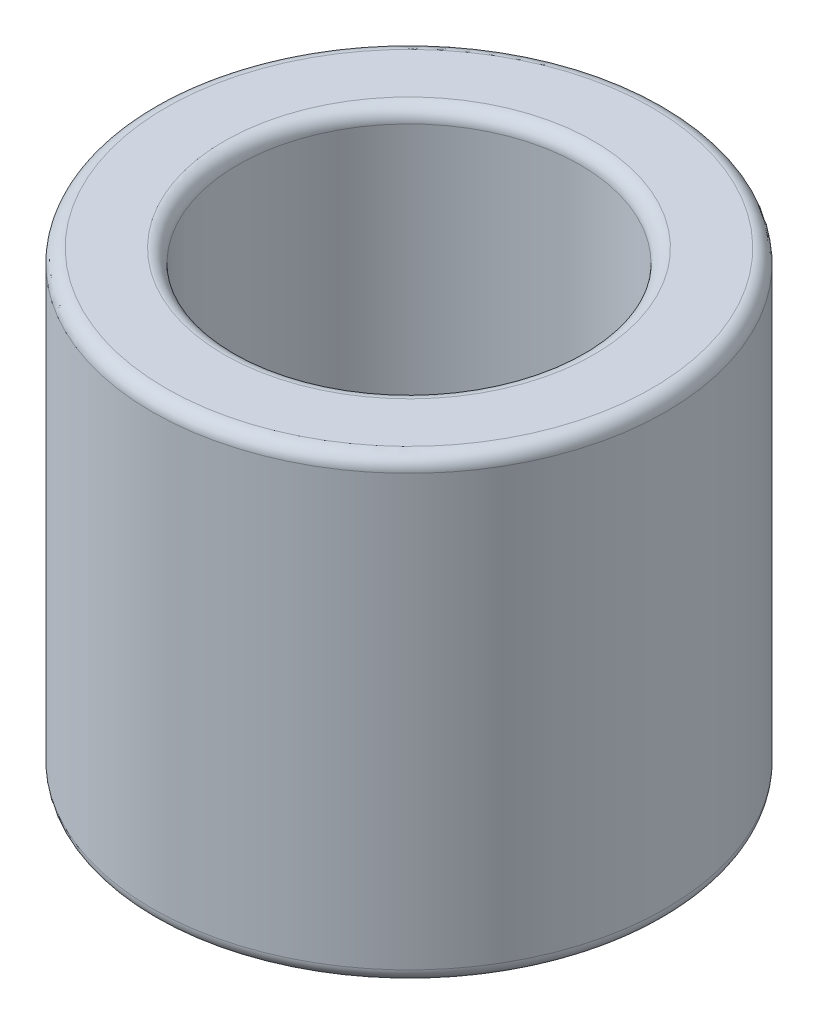
ISO-10303-21;
HEADER;
FILE_DESCRIPTION(('STEP AP214'),'2;1');
FILE_NAME('part.step','',(''),(''),'','','');
FILE_SCHEMA(('AUTOMOTIVE_DESIGN { 1 0 10303 214 1 1 1 1 }'));
ENDSEC;
DATA;
#1=APPLICATION_CONTEXT('core data for automotive mechanical design processes');
#2=APPLICATION_PROTOCOL_DEFINITION('international standard','automotive_design',2000,#1);
#3=PRODUCT_CONTEXT('',#1,'mechanical');
#4=PRODUCT('Part','Part','',(#3));
#5=PRODUCT_RELATED_PRODUCT_CATEGORY('part','',(#4));
#6=PRODUCT_DEFINITION_FORMATION('','',#4);
#7=PRODUCT_DEFINITION_CONTEXT('part definition',#1,'design');
#8=PRODUCT_DEFINITION('design','',#6,#7);
#9=PRODUCT_DEFINITION_SHAPE('','',#8);
#10=(LENGTH_UNIT() NAMED_UNIT(*) SI_UNIT(.MILLI.,.METRE.));
#11=(NAMED_UNIT(*) PLANE_ANGLE_UNIT() SI_UNIT($,.RADIAN.));
#12=(NAMED_UNIT(*) SI_UNIT($,.STERADIAN.) SOLID_ANGLE_UNIT());
#13=UNCERTAINTY_MEASURE_WITH_UNIT(LENGTH_MEASURE(1.E-05),#10,'distance_accuracy_value','');
#14=(GEOMETRIC_REPRESENTATION_CONTEXT(3) GLOBAL_UNCERTAINTY_ASSIGNED_CONTEXT((#13)) GLOBAL_UNIT_ASSIGNED_CONTEXT((#10,
#11,#12)) REPRESENTATION_CONTEXT('',''));
#15=CARTESIAN_POINT('',(0.,0.,0.));
#16=DIRECTION('',(0.,0.,1.));
#17=DIRECTION('',(1.,0.,0.));
#18=AXIS2_PLACEMENT_3D('',#15,#16,#17);
#19=CARTESIAN_POINT('',(0.,8.4836,0.));
#20=DIRECTION('',(0.,1.,0.));
#21=DIRECTION('',(0.,0.,1.));
#22=AXIS2_PLACEMENT_3D('',#19,#20,#21);
#23=PLANE('',#22);
#24=CARTESIAN_POINT('',(0.,8.4836,0.));
#25=DIRECTION('',(0.,1.,0.));
#26=DIRECTION('',(0.,0.,1.));
#27=AXIS2_PLACEMENT_3D('',#24,#25,#26);
#28=CIRCLE('',#27,4.5085);
#29=CARTESIAN_POINT('',(0.,8.4836,4.5085));
#30=VERTEX_POINT('',#29);
#31=EDGE_CURVE('E10',#30,#30,#28,.T.);
#32=ORIENTED_EDGE('',*,*,#31,.T.);
#33=EDGE_LOOP('',(#32));
#34=FACE_BOUND('',#33,.T.);
#35=CARTESIAN_POINT('',(0.,8.4836,0.));
#36=DIRECTION('',(0.,1.,0.));
#37=DIRECTION('',(0.,0.,1.));
#38=AXIS2_PLACEMENT_3D('',#35,#36,#37);
#39=CIRCLE('',#38,3.429);
#40=CARTESIAN_POINT('',(0.,8.4836,3.429));
#41=VERTEX_POINT('',#40);
#42=EDGE_CURVE('E40',#41,#41,#39,.F.);
#43=ORIENTED_EDGE('',*,*,#42,.T.);
#44=EDGE_LOOP('',(#43));
#45=FACE_BOUND('',#44,.T.);
#46=ADVANCED_FACE('F33',(#34,#45),#23,.T.);
#47=CARTESIAN_POINT('',(0.,0.,0.));
#48=DIRECTION('',(0.,1.,0.));
#49=DIRECTION('',(0.,0.,1.));
#50=AXIS2_PLACEMENT_3D('',#47,#48,#49);
#51=PLANE('',#50);
#52=CARTESIAN_POINT('',(0.,0.,0.));
#53=DIRECTION('',(0.,1.,0.));
#54=DIRECTION('',(0.,0.,1.));
#55=AXIS2_PLACEMENT_3D('',#52,#53,#54);
#56=CIRCLE('',#55,4.5085);
#57=CARTESIAN_POINT('',(0.,0.,4.5085));
#58=VERTEX_POINT('',#57);
#59=EDGE_CURVE('E53',#58,#58,#56,.F.);
#60=ORIENTED_EDGE('',*,*,#59,.T.);
#61=EDGE_LOOP('',(#60));
#62=FACE_BOUND('',#61,.T.);
#63=CARTESIAN_POINT('',(0.,0.,0.));
#64=DIRECTION('',(0.,1.,0.));
#65=DIRECTION('',(0.,0.,1.));
#66=AXIS2_PLACEMENT_3D('',#63,#64,#65);
#67=CIRCLE('',#66,3.429);
#68=CARTESIAN_POINT('',(0.,0.,3.429));
#69=VERTEX_POINT('',#68);
#70=EDGE_CURVE('E56',#69,#69,#67,.T.);
#71=ORIENTED_EDGE('',*,*,#70,.T.);
#72=EDGE_LOOP('',(#71));
#73=FACE_BOUND('',#72,.T.);
#74=ADVANCED_FACE('F81',(#62,#73),#51,.F.);
#75=CARTESIAN_POINT('',(0.,8.4836,0.));
#76=DIRECTION('',(0.,-1.,0.));
#77=DIRECTION('',(0.,0.,-1.));
#78=AXIS2_PLACEMENT_3D('',#75,#76,#77);
#79=CYLINDRICAL_SURFACE('',#78,4.7625);
#80=CARTESIAN_POINT('',(0.,0.254000000000001,0.));
#81=DIRECTION('',(0.,1.,0.));
#82=DIRECTION('',(0.,0.,1.));
#83=AXIS2_PLACEMENT_3D('',#80,#81,#82);
#84=CIRCLE('',#83,4.7625);
#85=CARTESIAN_POINT('',(0.,0.253999999999999,-4.7625));
#86=VERTEX_POINT('',#85);
#87=EDGE_CURVE('E59',#86,#86,#84,.T.);
#88=CARTESIAN_POINT('',(0.,8.2296,0.));
#89=DIRECTION('',(0.,1.,0.));
#90=DIRECTION('',(0.,0.,1.));
#91=AXIS2_PLACEMENT_3D('',#88,#89,#90);
#92=CIRCLE('',#91,4.7625);
#93=CARTESIAN_POINT('',(0.,8.2296,-4.7625));
#94=VERTEX_POINT('',#93);
#95=EDGE_CURVE('E62',#94,#94,#92,.F.);
#96=CARTESIAN_POINT('',(0.,0.253999999999999,-4.7625));
#97=CARTESIAN_POINT('',(0.,0.337079166666666,-4.7625));
#98=CARTESIAN_POINT('',(0.,0.420158333333333,-4.7625));
#99=CARTESIAN_POINT('',(0.,0.586316666666666,-4.7625));
#100=CARTESIAN_POINT('',(0.,0.669395833333332,-4.7625));
#101=CARTESIAN_POINT('',(0.,0.835554166666665,-4.7625));
#102=CARTESIAN_POINT('',(0.,0.918633333333331,-4.7625));
#103=CARTESIAN_POINT('',(0.,1.08479166666666,-4.7625));
#104=CARTESIAN_POINT('',(0.,1.16787083333333,-4.7625));
#105=CARTESIAN_POINT('',(0.,1.33402916666666,-4.7625));
#106=CARTESIAN_POINT('',(0.,1.41710833333333,-4.7625));
#107=CARTESIAN_POINT('',(0.,1.58326666666666,-4.7625));
#108=CARTESIAN_POINT('',(0.,1.66634583333333,-4.7625));
#109=CARTESIAN_POINT('',(0.,1.83250416666667,-4.7625));
#110=CARTESIAN_POINT('',(0.,1.91558333333333,-4.7625));
#111=CARTESIAN_POINT('',(0.,2.08174166666667,-4.7625));
#112=CARTESIAN_POINT('',(0.,2.16482083333333,-4.7625));
#113=CARTESIAN_POINT('',(0.,2.33097916666666,-4.7625));
#114=CARTESIAN_POINT('',(0.,2.41405833333333,-4.7625));
#115=CARTESIAN_POINT('',(0.,2.58021666666667,-4.7625));
#116=CARTESIAN_POINT('',(0.,2.66329583333333,-4.7625));
#117=CARTESIAN_POINT('',(0.,2.82945416666666,-4.7625));
#118=CARTESIAN_POINT('',(0.,2.91253333333333,-4.7625));
#119=CARTESIAN_POINT('',(0.,3.07869166666667,-4.7625));
#120=CARTESIAN_POINT('',(0.,3.16177083333333,-4.7625));
#121=CARTESIAN_POINT('',(0.,3.32792916666667,-4.7625));
#122=CARTESIAN_POINT('',(0.,3.41100833333333,-4.7625));
#123=CARTESIAN_POINT('',(0.,3.57716666666667,-4.7625));
#124=CARTESIAN_POINT('',(0.,3.66024583333333,-4.7625));
#125=CARTESIAN_POINT('',(0.,3.82640416666667,-4.7625));
#126=CARTESIAN_POINT('',(0.,3.90948333333333,-4.7625));
#127=CARTESIAN_POINT('',(0.,4.07564166666667,-4.7625));
#128=CARTESIAN_POINT('',(0.,4.15872083333333,-4.7625));
#129=CARTESIAN_POINT('',(0.,4.32487916666667,-4.7625));
#130=CARTESIAN_POINT('',(0.,4.40795833333333,-4.7625));
#131=CARTESIAN_POINT('',(0.,4.57411666666667,-4.7625));
#132=CARTESIAN_POINT('',(0.,4.65719583333333,-4.7625));
#133=CARTESIAN_POINT('',(0.,4.82335416666666,-4.7625));
#134=CARTESIAN_POINT('',(0.,4.90643333333333,-4.7625));
#135=CARTESIAN_POINT('',(0.,5.07259166666667,-4.7625));
#136=CARTESIAN_POINT('',(0.,5.15567083333333,-4.7625));
#137=CARTESIAN_POINT('',(0.,5.32182916666666,-4.7625));
#138=CARTESIAN_POINT('',(0.,5.40490833333333,-4.7625));
#139=CARTESIAN_POINT('',(0.,5.57106666666667,-4.7625));
#140=CARTESIAN_POINT('',(0.,5.65414583333333,-4.7625));
#141=CARTESIAN_POINT('',(0.,5.82030416666666,-4.7625));
#142=CARTESIAN_POINT('',(0.,5.90338333333333,-4.7625));
#143=CARTESIAN_POINT('',(0.,6.06954166666667,-4.7625));
#144=CARTESIAN_POINT('',(0.,6.15262083333333,-4.7625));
#145=CARTESIAN_POINT('',(0.,6.31877916666667,-4.7625));
#146=CARTESIAN_POINT('',(0.,6.40185833333333,-4.7625));
#147=CARTESIAN_POINT('',(0.,6.56801666666667,-4.7625));
#148=CARTESIAN_POINT('',(0.,6.65109583333333,-4.7625));
#149=CARTESIAN_POINT('',(0.,6.81725416666666,-4.7625));
#150=CARTESIAN_POINT('',(0.,6.90033333333333,-4.7625));
#151=CARTESIAN_POINT('',(0.,7.06649166666667,-4.7625));
#152=CARTESIAN_POINT('',(0.,7.14957083333333,-4.7625));
#153=CARTESIAN_POINT('',(0.,7.31572916666666,-4.7625));
#154=CARTESIAN_POINT('',(0.,7.39880833333333,-4.7625));
#155=CARTESIAN_POINT('',(0.,7.56496666666667,-4.7625));
#156=CARTESIAN_POINT('',(0.,7.64804583333333,-4.7625));
#157=CARTESIAN_POINT('',(0.,7.81420416666666,-4.7625));
#158=CARTESIAN_POINT('',(0.,7.89728333333333,-4.7625));
#159=CARTESIAN_POINT('',(0.,8.06344166666667,-4.7625));
#160=CARTESIAN_POINT('',(0.,8.14652083333333,-4.7625));
#161=CARTESIAN_POINT('',(0.,8.2296,-4.7625));
#162=B_SPLINE_CURVE_WITH_KNOTS('',3,(#96,#97,#98,#99,#100,#101,#102,#103,#104,#105,#106,#107,
#108,#109,#110,#111,#112,#113,#114,#115,#116,#117,#118,#119,#120,#121,#122,#123,#124,#125,#126,
#127,#128,#129,#130,#131,#132,#133,#134,#135,#136,#137,#138,#139,#140,#141,#142,#143,#144,#145,
#146,#147,#148,#149,#150,#151,#152,#153,#154,#155,#156,#157,#158,#159,#160,#161),.UNSPECIFIED.,
.F.,.F.,(4,2,2,2,2,2,2,2,2,2,2,2,2,2,2,2,2,2,2,2,2,2,2,2,2,2,2,2,2,2,2,2,4),(0.,
0.249237500000001,0.498474999999999,0.747712499999999,0.996949999999999,1.2461875,1.495425,
1.7446625,1.9939,2.2431375,2.492375,2.7416125,2.99085,3.2400875,3.489325,3.7385625,3.9878,
4.2370375,4.486275,4.7355125,4.98475,5.2339875,5.483225,5.7324625,5.9817,6.2309375,6.480175,
6.7294125,6.97865,7.2278875,7.477125,7.7263625,7.9756),.UNSPECIFIED.);
#163=EDGE_CURVE('BSEAM66',#86,#94,#162,.T.);
#164=ORIENTED_EDGE('',*,*,#87,.T.);
#165=ORIENTED_EDGE('',*,*,#95,.T.);
#166=ORIENTED_EDGE('',*,*,#163,.T.);
#167=ORIENTED_EDGE('',*,*,#163,.F.);
#168=EDGE_LOOP('',(#164,#166,#165,#167));
#169=FACE_BOUND('',#168,.T.);
#170=ADVANCED_FACE('F66',(#169),#79,.T.);
#171=CARTESIAN_POINT('',(0.,8.4836,0.));
#172=DIRECTION('',(0.,-1.,0.));
#173=DIRECTION('',(0.,0.,-1.));
#174=AXIS2_PLACEMENT_3D('',#171,#172,#173);
#175=CYLINDRICAL_SURFACE('',#174,3.175);
#176=CARTESIAN_POINT('',(0.,0.254000000000001,0.));
#177=DIRECTION('',(0.,1.,0.));
#178=DIRECTION('',(0.,0.,1.));
#179=AXIS2_PLACEMENT_3D('',#176,#177,#178);
#180=CIRCLE('',#179,3.175);
#181=CARTESIAN_POINT('',(0.,0.253999999999999,-3.175));
#182=VERTEX_POINT('',#181);
#183=EDGE_CURVE('E44',#182,#182,#180,.F.);
#184=CARTESIAN_POINT('',(0.,8.2296,0.));
#185=DIRECTION('',(0.,1.,0.));
#186=DIRECTION('',(0.,0.,1.));
#187=AXIS2_PLACEMENT_3D('',#184,#185,#186);
#188=CIRCLE('',#187,3.175);
#189=CARTESIAN_POINT('',(0.,8.2296,-3.175));
#190=VERTEX_POINT('',#189);
#191=EDGE_CURVE('E48',#190,#190,#188,.T.);
#192=CARTESIAN_POINT('',(0.,0.253999999999999,-3.175));
#193=CARTESIAN_POINT('',(0.,0.337079166666666,-3.175));
#194=CARTESIAN_POINT('',(0.,0.420158333333333,-3.175));
#195=CARTESIAN_POINT('',(0.,0.586316666666666,-3.175));
#196=CARTESIAN_POINT('',(0.,0.669395833333332,-3.175));
#197=CARTESIAN_POINT('',(0.,0.835554166666665,-3.175));
#198=CARTESIAN_POINT('',(0.,0.918633333333331,-3.175));
#199=CARTESIAN_POINT('',(0.,1.08479166666666,-3.175));
#200=CARTESIAN_POINT('',(0.,1.16787083333333,-3.175));
#201=CARTESIAN_POINT('',(0.,1.33402916666666,-3.175));
#202=CARTESIAN_POINT('',(0.,1.41710833333333,-3.175));
#203=CARTESIAN_POINT('',(0.,1.58326666666666,-3.175));
#204=CARTESIAN_POINT('',(0.,1.66634583333333,-3.175));
#205=CARTESIAN_POINT('',(0.,1.83250416666667,-3.175));
#206=CARTESIAN_POINT('',(0.,1.91558333333333,-3.175));
#207=CARTESIAN_POINT('',(0.,2.08174166666667,-3.175));
#208=CARTESIAN_POINT('',(0.,2.16482083333333,-3.175));
#209=CARTESIAN_POINT('',(0.,2.33097916666666,-3.175));
#210=CARTESIAN_POINT('',(0.,2.41405833333333,-3.175));
#211=CARTESIAN_POINT('',(0.,2.58021666666667,-3.175));
#212=CARTESIAN_POINT('',(0.,2.66329583333333,-3.175));
#213=CARTESIAN_POINT('',(0.,2.82945416666666,-3.175));
#214=CARTESIAN_POINT('',(0.,2.91253333333333,-3.175));
#215=CARTESIAN_POINT('',(0.,3.07869166666667,-3.175));
#216=CARTESIAN_POINT('',(0.,3.16177083333333,-3.175));
#217=CARTESIAN_POINT('',(0.,3.32792916666667,-3.175));
#218=CARTESIAN_POINT('',(0.,3.41100833333333,-3.175));
#219=CARTESIAN_POINT('',(0.,3.57716666666667,-3.175));
#220=CARTESIAN_POINT('',(0.,3.66024583333333,-3.175));
#221=CARTESIAN_POINT('',(0.,3.82640416666667,-3.175));
#222=CARTESIAN_POINT('',(0.,3.90948333333333,-3.175));
#223=CARTESIAN_POINT('',(0.,4.07564166666667,-3.175));
#224=CARTESIAN_POINT('',(0.,4.15872083333333,-3.175));
#225=CARTESIAN_POINT('',(0.,4.32487916666667,-3.175));
#226=CARTESIAN_POINT('',(0.,4.40795833333333,-3.175));
#227=CARTESIAN_POINT('',(0.,4.57411666666667,-3.175));
#228=CARTESIAN_POINT('',(0.,4.65719583333333,-3.175));
#229=CARTESIAN_POINT('',(0.,4.82335416666666,-3.175));
#230=CARTESIAN_POINT('',(0.,4.90643333333333,-3.175));
#231=CARTESIAN_POINT('',(0.,5.07259166666667,-3.175));
#232=CARTESIAN_POINT('',(0.,5.15567083333333,-3.175));
#233=CARTESIAN_POINT('',(0.,5.32182916666666,-3.175));
#234=CARTESIAN_POINT('',(0.,5.40490833333333,-3.175));
#235=CARTESIAN_POINT('',(0.,5.57106666666667,-3.175));
#236=CARTESIAN_POINT('',(0.,5.65414583333333,-3.175));
#237=CARTESIAN_POINT('',(0.,5.82030416666666,-3.175));
#238=CARTESIAN_POINT('',(0.,5.90338333333333,-3.175));
#239=CARTESIAN_POINT('',(0.,6.06954166666667,-3.175));
#240=CARTESIAN_POINT('',(0.,6.15262083333333,-3.175));
#241=CARTESIAN_POINT('',(0.,6.31877916666667,-3.175));
#242=CARTESIAN_POINT('',(0.,6.40185833333333,-3.175));
#243=CARTESIAN_POINT('',(0.,6.56801666666667,-3.175));
#244=CARTESIAN_POINT('',(0.,6.65109583333333,-3.175));
#245=CARTESIAN_POINT('',(0.,6.81725416666666,-3.175));
#246=CARTESIAN_POINT('',(0.,6.90033333333333,-3.175));
#247=CARTESIAN_POINT('',(0.,7.06649166666667,-3.175));
#248=CARTESIAN_POINT('',(0.,7.14957083333333,-3.175));
#249=CARTESIAN_POINT('',(0.,7.31572916666666,-3.175));
#250=CARTESIAN_POINT('',(0.,7.39880833333333,-3.175));
#251=CARTESIAN_POINT('',(0.,7.56496666666667,-3.175));
#252=CARTESIAN_POINT('',(0.,7.64804583333333,-3.175));
#253=CARTESIAN_POINT('',(0.,7.81420416666666,-3.175));
#254=CARTESIAN_POINT('',(0.,7.89728333333333,-3.175));
#255=CARTESIAN_POINT('',(0.,8.06344166666667,-3.175));
#256=CARTESIAN_POINT('',(0.,8.14652083333333,-3.175));
#257=CARTESIAN_POINT('',(0.,8.2296,-3.175));
#258=B_SPLINE_CURVE_WITH_KNOTS('',3,(#192,#193,#194,#195,#196,#197,#198,#199,#200,#201,#202,
#203,#204,#205,#206,#207,#208,#209,#210,#211,#212,#213,#214,#215,#216,#217,#218,#219,#220,#221,
#222,#223,#224,#225,#226,#227,#228,#229,#230,#231,#232,#233,#234,#235,#236,#237,#238,#239,#240,
#241,#242,#243,#244,#245,#246,#247,#248,#249,#250,#251,#252,#253,#254,#255,#256,#257),
.UNSPECIFIED.,.F.,.F.,(4,2,2,2,2,2,2,2,2,2,2,2,2,2,2,2,2,2,2,2,2,2,2,2,2,2,2,2,2,2,2,2,4),(0.,
0.249237500000001,0.498474999999999,0.747712499999999,0.996949999999999,1.2461875,1.495425,
1.7446625,1.9939,2.2431375,2.492375,2.7416125,2.99085,3.2400875,3.489325,3.7385625,3.9878,
4.2370375,4.486275,4.7355125,4.98475,5.2339875,5.483225,5.7324625,5.9817,6.2309375,6.480175,
6.7294125,6.97865,7.2278875,7.477125,7.7263625,7.9756),.UNSPECIFIED.);
#259=EDGE_CURVE('BSEAM89',#182,#190,#258,.T.);
#260=ORIENTED_EDGE('',*,*,#183,.T.);
#261=ORIENTED_EDGE('',*,*,#191,.T.);
#262=ORIENTED_EDGE('',*,*,#259,.T.);
#263=ORIENTED_EDGE('',*,*,#259,.F.);
#264=EDGE_LOOP('',(#260,#262,#261,#263));
#265=FACE_BOUND('',#264,.T.);
#266=ADVANCED_FACE('F89',(#265),#175,.F.);
#267=CARTESIAN_POINT('',(0.,0.254000000000001,0.));
#268=DIRECTION('',(0.,1.,0.));
#269=DIRECTION('',(0.,0.,1.));
#270=AXIS2_PLACEMENT_3D('',#267,#268,#269);
#271=TOROIDAL_SURFACE('',#270,4.5085,0.254);
#272=ORIENTED_EDGE('',*,*,#59,.F.);
#273=EDGE_LOOP('',(#272));
#274=FACE_BOUND('',#273,.T.);
#275=ORIENTED_EDGE('',*,*,#87,.F.);
#276=EDGE_LOOP('',(#275));
#277=FACE_BOUND('',#276,.T.);
#278=ADVANCED_FACE('F77',(#274,#277),#271,.T.);
#279=CARTESIAN_POINT('',(0.,0.254000000000001,0.));
#280=DIRECTION('',(0.,1.,0.));
#281=DIRECTION('',(0.,0.,1.));
#282=AXIS2_PLACEMENT_3D('',#279,#280,#281);
#283=TOROIDAL_SURFACE('',#282,3.429,0.254);
#284=ORIENTED_EDGE('',*,*,#183,.F.);
#285=EDGE_LOOP('',(#284));
#286=FACE_BOUND('',#285,.T.);
#287=ORIENTED_EDGE('',*,*,#70,.F.);
#288=EDGE_LOOP('',(#287));
#289=FACE_BOUND('',#288,.T.);
#290=ADVANCED_FACE('F71',(#286,#289),#283,.T.);
#291=CARTESIAN_POINT('',(0.,8.2296,0.));
#292=DIRECTION('',(0.,1.,0.));
#293=DIRECTION('',(0.,0.,1.));
#294=AXIS2_PLACEMENT_3D('',#291,#292,#293);
#295=TOROIDAL_SURFACE('',#294,4.5085,0.254);
#296=ORIENTED_EDGE('',*,*,#95,.F.);
#297=EDGE_LOOP('',(#296));
#298=FACE_BOUND('',#297,.T.);
#299=ORIENTED_EDGE('',*,*,#31,.F.);
#300=EDGE_LOOP('',(#299));
#301=FACE_BOUND('',#300,.T.);
#302=ADVANCED_FACE('F68',(#298,#301),#295,.T.);
#303=CARTESIAN_POINT('',(0.,8.2296,0.));
#304=DIRECTION('',(0.,1.,0.));
#305=DIRECTION('',(0.,0.,1.));
#306=AXIS2_PLACEMENT_3D('',#303,#304,#305);
#307=TOROIDAL_SURFACE('',#306,3.429,0.254);
#308=ORIENTED_EDGE('',*,*,#42,.F.);
#309=EDGE_LOOP('',(#308));
#310=FACE_BOUND('',#309,.T.);
#311=ORIENTED_EDGE('',*,*,#191,.F.);
#312=EDGE_LOOP('',(#311));
#313=FACE_BOUND('',#312,.T.);
#314=ADVANCED_FACE('F35',(#310,#313),#307,.T.);
#315=CLOSED_SHELL('',(#46,#74,#170,#266,#278,#290,#302,#314));
#316=MANIFOLD_SOLID_BREP('B2',#315);
#317=ADVANCED_BREP_SHAPE_REPRESENTATION('',(#18,#316),#14);
#318=SHAPE_DEFINITION_REPRESENTATION(#9,#317);
ENDSEC;
END-ISO-10303-21;
